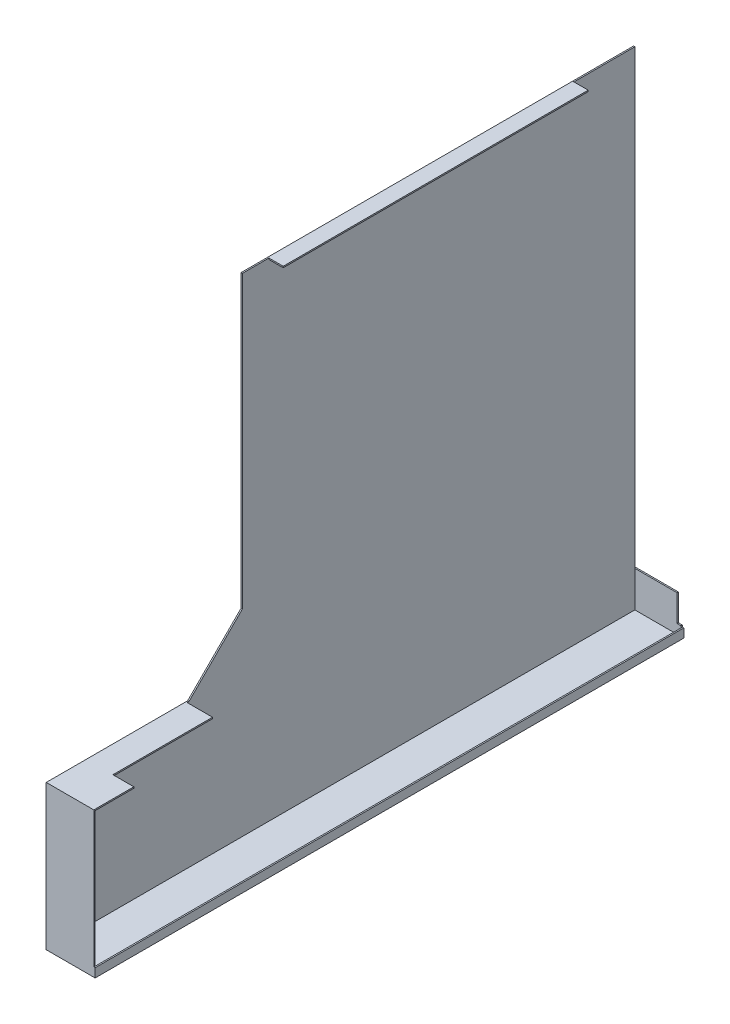
ISO-10303-21;
HEADER;
FILE_DESCRIPTION(('STEP AP214'),'2;1');
FILE_NAME('part.step','',(''),(''),'','','');
FILE_SCHEMA(('AUTOMOTIVE_DESIGN { 1 0 10303 214 1 1 1 1 }'));
ENDSEC;
DATA;
#1=APPLICATION_CONTEXT('core data for automotive mechanical design processes');
#2=APPLICATION_PROTOCOL_DEFINITION('international standard','automotive_design',2000,#1);
#3=PRODUCT_CONTEXT('',#1,'mechanical');
#4=PRODUCT('Part','Part','',(#3));
#5=PRODUCT_RELATED_PRODUCT_CATEGORY('part','',(#4));
#6=PRODUCT_DEFINITION_FORMATION('','',#4);
#7=PRODUCT_DEFINITION_CONTEXT('part definition',#1,'design');
#8=PRODUCT_DEFINITION('design','',#6,#7);
#9=PRODUCT_DEFINITION_SHAPE('','',#8);
#10=(LENGTH_UNIT() NAMED_UNIT(*) SI_UNIT(.MILLI.,.METRE.));
#11=(NAMED_UNIT(*) PLANE_ANGLE_UNIT() SI_UNIT($,.RADIAN.));
#12=(NAMED_UNIT(*) SI_UNIT($,.STERADIAN.) SOLID_ANGLE_UNIT());
#13=UNCERTAINTY_MEASURE_WITH_UNIT(LENGTH_MEASURE(1.E-05),#10,'distance_accuracy_value','');
#14=(GEOMETRIC_REPRESENTATION_CONTEXT(3) GLOBAL_UNCERTAINTY_ASSIGNED_CONTEXT((#13)) GLOBAL_UNIT_ASSIGNED_CONTEXT((#10,
#11,#12)) REPRESENTATION_CONTEXT('',''));
#15=CARTESIAN_POINT('',(0.,0.,0.));
#16=DIRECTION('',(0.,0.,1.));
#17=DIRECTION('',(1.,0.,0.));
#18=AXIS2_PLACEMENT_3D('',#15,#16,#17);
#19=CARTESIAN_POINT('',(-245.5,-307.,1434.5));
#20=DIRECTION('',(-1.,0.,0.));
#21=DIRECTION('',(0.,-1.,0.));
#22=AXIS2_PLACEMENT_3D('',#19,#20,#21);
#23=PLANE('',#22);
#24=DIRECTION('',(0.,-1.,0.));
#25=VECTOR('',#24,1.);
#26=CARTESIAN_POINT('',(-245.5,243.,1504.4));
#27=LINE('',#26,#25);
#28=CARTESIAN_POINT('',(-245.5,243.,1504.4));
#29=VERTEX_POINT('',#28);
#30=CARTESIAN_POINT('',(-245.5,239.,1504.4));
#31=VERTEX_POINT('',#30);
#32=EDGE_CURVE('E35',#29,#31,#27,.T.);
#33=ORIENTED_EDGE('',*,*,#32,.F.);
#34=DIRECTION('',(0.,0.,-1.));
#35=VECTOR('',#34,1.);
#36=CARTESIAN_POINT('',(-245.5,243.,1504.4));
#37=LINE('',#36,#35);
#38=CARTESIAN_POINT('',(-245.5,243.,1436.));
#39=VERTEX_POINT('',#38);
#40=EDGE_CURVE('E11',#29,#39,#37,.T.);
#41=ORIENTED_EDGE('',*,*,#40,.T.);
#42=DIRECTION('',(0.,-1.,0.));
#43=VECTOR('',#42,1.);
#44=CARTESIAN_POINT('',(-245.5,243.,1436.));
#45=LINE('',#44,#43);
#46=CARTESIAN_POINT('',(-245.5,-265.,1436.));
#47=VERTEX_POINT('',#46);
#48=EDGE_CURVE('E27',#39,#47,#45,.T.);
#49=ORIENTED_EDGE('',*,*,#48,.T.);
#50=DIRECTION('',(0.,0.,1.));
#51=VECTOR('',#50,1.);
#52=CARTESIAN_POINT('',(-245.5,-265.,1434.5));
#53=LINE('',#52,#51);
#54=CARTESIAN_POINT('',(-245.5,-265.,1434.5));
#55=VERTEX_POINT('',#54);
#56=EDGE_CURVE('E259',#55,#47,#53,.T.);
#57=ORIENTED_EDGE('',*,*,#56,.F.);
#58=DIRECTION('',(0.,-1.,0.));
#59=VECTOR('',#58,1.);
#60=CARTESIAN_POINT('',(-245.5,-265.,1434.5));
#61=LINE('',#60,#59);
#62=CARTESIAN_POINT('',(-245.5,-307.,1434.5));
#63=VERTEX_POINT('',#62);
#64=EDGE_CURVE('E319',#55,#63,#61,.T.);
#65=ORIENTED_EDGE('',*,*,#64,.T.);
#66=DIRECTION('',(0.,0.,1.));
#67=VECTOR('',#66,1.);
#68=CARTESIAN_POINT('',(-245.5,-307.,1434.5));
#69=LINE('',#68,#67);
#70=CARTESIAN_POINT('',(-245.5,-307.,2096.5));
#71=VERTEX_POINT('',#70);
#72=EDGE_CURVE('E316',#63,#71,#69,.T.);
#73=ORIENTED_EDGE('',*,*,#72,.T.);
#74=DIRECTION('',(0.,1.,0.));
#75=VECTOR('',#74,1.);
#76=CARTESIAN_POINT('',(-245.5,-307.,2096.5));
#77=LINE('',#76,#75);
#78=CARTESIAN_POINT('',(-245.5,-144.,2096.5));
#79=VERTEX_POINT('',#78);
#80=EDGE_CURVE('E320',#71,#79,#77,.T.);
#81=ORIENTED_EDGE('',*,*,#80,.T.);
#82=DIRECTION('',(0.,0.,-1.));
#83=VECTOR('',#82,1.);
#84=CARTESIAN_POINT('',(-245.5,-144.,2096.5));
#85=LINE('',#84,#83);
#86=CARTESIAN_POINT('',(-245.5,-144.,1937.5));
#87=VERTEX_POINT('',#86);
#88=EDGE_CURVE('E358',#79,#87,#85,.T.);
#89=ORIENTED_EDGE('',*,*,#88,.T.);
#90=DIRECTION('',(0.,-0.707106781186548,0.707106781186548));
#91=VECTOR('',#90,1.);
#92=CARTESIAN_POINT('',(-245.5,-84.,1877.5));
#93=LINE('',#92,#91);
#94=CARTESIAN_POINT('',(-245.5,-84.,1877.5));
#95=VERTEX_POINT('',#94);
#96=EDGE_CURVE('E369',#95,#87,#93,.T.);
#97=ORIENTED_EDGE('',*,*,#96,.F.);
#98=DIRECTION('',(0.,-1.,0.));
#99=VECTOR('',#98,1.);
#100=CARTESIAN_POINT('',(-245.5,243.,1877.5));
#101=LINE('',#100,#99);
#102=CARTESIAN_POINT('',(-245.5,243.,1877.5));
#103=VERTEX_POINT('',#102);
#104=EDGE_CURVE('E307',#103,#95,#101,.T.);
#105=ORIENTED_EDGE('',*,*,#104,.F.);
#106=DIRECTION('',(0.,0.,-1.));
#107=VECTOR('',#106,1.);
#108=CARTESIAN_POINT('',(-245.5,243.,1877.5));
#109=LINE('',#108,#107);
#110=CARTESIAN_POINT('',(-245.5,243.,1504.5));
#111=VERTEX_POINT('',#110);
#112=EDGE_CURVE('E330',#103,#111,#109,.T.);
#113=ORIENTED_EDGE('',*,*,#112,.T.);
#114=DIRECTION('',(0.,-1.,0.));
#115=VECTOR('',#114,1.);
#116=CARTESIAN_POINT('',(-245.5,243.,1504.5));
#117=LINE('',#116,#115);
#118=CARTESIAN_POINT('',(-245.5,239.,1504.5));
#119=VERTEX_POINT('',#118);
#120=EDGE_CURVE('E328',#111,#119,#117,.T.);
#121=ORIENTED_EDGE('',*,*,#120,.T.);
#122=DIRECTION('',(0.,0.,1.));
#123=VECTOR('',#122,1.);
#124=CARTESIAN_POINT('',(-245.5,239.,1504.4));
#125=LINE('',#124,#123);
#126=EDGE_CURVE('E255',#31,#119,#125,.T.);
#127=ORIENTED_EDGE('',*,*,#126,.F.);
#128=EDGE_LOOP('',(#33,#41,#49,#57,#65,#73,#81,#89,#97,#105,#113,#121,#127));
#129=FACE_BOUND('',#128,.T.);
#130=ADVANCED_FACE('F17',(#129),#23,.T.);
#131=CARTESIAN_POINT('',(-245.5,239.,1434.5));
#132=DIRECTION('',(0.,1.,0.));
#133=DIRECTION('',(0.,0.,-1.));
#134=AXIS2_PLACEMENT_3D('',#131,#132,#133);
#135=PLANE('',#134);
#136=DIRECTION('',(-1.,0.,0.));
#137=VECTOR('',#136,1.);
#138=CARTESIAN_POINT('',(-244.,239.,1504.4));
#139=LINE('',#138,#137);
#140=CARTESIAN_POINT('',(-244.,239.,1504.4));
#141=VERTEX_POINT('',#140);
#142=EDGE_CURVE('E331',#141,#31,#139,.T.);
#143=ORIENTED_EDGE('',*,*,#142,.T.);
#144=ORIENTED_EDGE('',*,*,#126,.T.);
#145=DIRECTION('',(1.,0.,0.));
#146=VECTOR('',#145,1.);
#147=CARTESIAN_POINT('',(-245.5,239.,1504.5));
#148=LINE('',#147,#146);
#149=CARTESIAN_POINT('',(-244.,239.,1504.5));
#150=VERTEX_POINT('',#149);
#151=EDGE_CURVE('E252',#119,#150,#148,.T.);
#152=ORIENTED_EDGE('',*,*,#151,.T.);
#153=DIRECTION('',(0.,0.,1.));
#154=VECTOR('',#153,1.);
#155=CARTESIAN_POINT('',(-244.,239.,1504.4));
#156=LINE('',#155,#154);
#157=EDGE_CURVE('E306',#141,#150,#156,.T.);
#158=ORIENTED_EDGE('',*,*,#157,.F.);
#159=EDGE_LOOP('',(#143,#144,#152,#158));
#160=FACE_BOUND('',#159,.T.);
#161=ADVANCED_FACE('F514',(#160),#135,.T.);
#162=CARTESIAN_POINT('',(-244.,243.,1434.5));
#163=DIRECTION('',(-1.,0.,0.));
#164=DIRECTION('',(0.,-1.,0.));
#165=AXIS2_PLACEMENT_3D('',#162,#163,#164);
#166=PLANE('',#165);
#167=DIRECTION('',(0.,-0.707106781186548,0.707106781186548));
#168=VECTOR('',#167,1.);
#169=CARTESIAN_POINT('',(-244.,-84.,1877.5));
#170=LINE('',#169,#168);
#171=CARTESIAN_POINT('',(-244.,-84.,1877.5));
#172=VERTEX_POINT('',#171);
#173=CARTESIAN_POINT('',(-244.,-144.,1937.5));
#174=VERTEX_POINT('',#173);
#175=EDGE_CURVE('E224',#172,#174,#170,.T.);
#176=ORIENTED_EDGE('',*,*,#175,.T.);
#177=DIRECTION('',(0.,0.,1.));
#178=VECTOR('',#177,1.);
#179=CARTESIAN_POINT('',(-244.,-144.,1937.5));
#180=LINE('',#179,#178);
#181=CARTESIAN_POINT('',(-244.,-144.,1939.5));
#182=VERTEX_POINT('',#181);
#183=EDGE_CURVE('E221',#174,#182,#180,.T.);
#184=ORIENTED_EDGE('',*,*,#183,.T.);
#185=DIRECTION('',(0.,1.,0.));
#186=VECTOR('',#185,1.);
#187=CARTESIAN_POINT('',(-244.,-145.5,1939.5));
#188=LINE('',#187,#186);
#189=CARTESIAN_POINT('',(-244.,-145.5,1939.5));
#190=VERTEX_POINT('',#189);
#191=EDGE_CURVE('E21',#190,#182,#188,.T.);
#192=ORIENTED_EDGE('',*,*,#191,.F.);
#193=DIRECTION('',(0.,0.,-1.));
#194=VECTOR('',#193,1.);
#195=CARTESIAN_POINT('',(-244.,-145.5,2095.));
#196=LINE('',#195,#194);
#197=CARTESIAN_POINT('',(-244.,-145.5,2095.));
#198=VERTEX_POINT('',#197);
#199=EDGE_CURVE('E219',#198,#190,#196,.T.);
#200=ORIENTED_EDGE('',*,*,#199,.F.);
#201=DIRECTION('',(0.,1.,0.));
#202=VECTOR('',#201,1.);
#203=CARTESIAN_POINT('',(-244.,-305.5,2095.));
#204=LINE('',#203,#202);
#205=CARTESIAN_POINT('',(-244.,-305.5,2095.));
#206=VERTEX_POINT('',#205);
#207=EDGE_CURVE('E404',#206,#198,#204,.T.);
#208=ORIENTED_EDGE('',*,*,#207,.F.);
#209=DIRECTION('',(0.,0.,1.));
#210=VECTOR('',#209,1.);
#211=CARTESIAN_POINT('',(-244.,-305.5,1436.));
#212=LINE('',#211,#210);
#213=CARTESIAN_POINT('',(-244.,-305.5,1436.));
#214=VERTEX_POINT('',#213);
#215=EDGE_CURVE('E338',#214,#206,#212,.T.);
#216=ORIENTED_EDGE('',*,*,#215,.F.);
#217=DIRECTION('',(0.,1.,0.));
#218=VECTOR('',#217,1.);
#219=CARTESIAN_POINT('',(-244.,-305.5,1436.));
#220=LINE('',#219,#218);
#221=CARTESIAN_POINT('',(-244.,-265.,1436.));
#222=VERTEX_POINT('',#221);
#223=EDGE_CURVE('E228',#214,#222,#220,.T.);
#224=ORIENTED_EDGE('',*,*,#223,.T.);
#225=DIRECTION('',(0.,-1.,0.));
#226=VECTOR('',#225,1.);
#227=CARTESIAN_POINT('',(-244.,243.,1436.));
#228=LINE('',#227,#226);
#229=CARTESIAN_POINT('',(-244.,243.,1436.));
#230=VERTEX_POINT('',#229);
#231=EDGE_CURVE('E260',#230,#222,#228,.T.);
#232=ORIENTED_EDGE('',*,*,#231,.F.);
#233=DIRECTION('',(0.,0.,1.));
#234=VECTOR('',#233,1.);
#235=CARTESIAN_POINT('',(-244.,243.,1436.));
#236=LINE('',#235,#234);
#237=CARTESIAN_POINT('',(-244.,243.,1504.4));
#238=VERTEX_POINT('',#237);
#239=EDGE_CURVE('E272',#230,#238,#236,.T.);
#240=ORIENTED_EDGE('',*,*,#239,.T.);
#241=DIRECTION('',(0.,-1.,0.));
#242=VECTOR('',#241,1.);
#243=CARTESIAN_POINT('',(-244.,243.,1504.4));
#244=LINE('',#243,#242);
#245=EDGE_CURVE('E275',#238,#141,#244,.T.);
#246=ORIENTED_EDGE('',*,*,#245,.T.);
#247=ORIENTED_EDGE('',*,*,#157,.T.);
#248=DIRECTION('',(0.,-1.,0.));
#249=VECTOR('',#248,1.);
#250=CARTESIAN_POINT('',(-244.,241.5,1504.5));
#251=LINE('',#250,#249);
#252=CARTESIAN_POINT('',(-244.,241.5,1504.5));
#253=VERTEX_POINT('',#252);
#254=EDGE_CURVE('E321',#253,#150,#251,.T.);
#255=ORIENTED_EDGE('',*,*,#254,.F.);
#256=DIRECTION('',(0.,0.,1.));
#257=VECTOR('',#256,1.);
#258=CARTESIAN_POINT('',(-244.,241.5,1504.5));
#259=LINE('',#258,#257);
#260=CARTESIAN_POINT('',(-244.,241.5,1847.5));
#261=VERTEX_POINT('',#260);
#262=EDGE_CURVE('E327',#253,#261,#259,.T.);
#263=ORIENTED_EDGE('',*,*,#262,.T.);
#264=DIRECTION('',(0.,1.,0.));
#265=VECTOR('',#264,1.);
#266=CARTESIAN_POINT('',(-244.,241.5,1847.5));
#267=LINE('',#266,#265);
#268=CARTESIAN_POINT('',(-244.,243.,1847.5));
#269=VERTEX_POINT('',#268);
#270=EDGE_CURVE('E310',#261,#269,#267,.T.);
#271=ORIENTED_EDGE('',*,*,#270,.T.);
#272=DIRECTION('',(0.,0.,-1.));
#273=VECTOR('',#272,1.);
#274=CARTESIAN_POINT('',(-244.,243.,1877.5));
#275=LINE('',#274,#273);
#276=CARTESIAN_POINT('',(-244.,243.,1877.5));
#277=VERTEX_POINT('',#276);
#278=EDGE_CURVE('E344',#277,#269,#275,.T.);
#279=ORIENTED_EDGE('',*,*,#278,.F.);
#280=DIRECTION('',(0.,1.,0.));
#281=VECTOR('',#280,1.);
#282=CARTESIAN_POINT('',(-244.,-84.,1877.5));
#283=LINE('',#282,#281);
#284=EDGE_CURVE('E349',#172,#277,#283,.T.);
#285=ORIENTED_EDGE('',*,*,#284,.F.);
#286=EDGE_LOOP('',(#176,#184,#192,#200,#208,#216,#224,#232,#240,#246,#247,#255,#263,#271,#279,#285));
#287=FACE_BOUND('',#286,.T.);
#288=ADVANCED_FACE('F222',(#287),#166,.F.);
#289=CARTESIAN_POINT('',(-245.5,243.,1877.5));
#290=DIRECTION('',(0.,0.,-1.));
#291=DIRECTION('',(0.,1.,0.));
#292=AXIS2_PLACEMENT_3D('',#289,#290,#291);
#293=PLANE('',#292);
#294=DIRECTION('',(1.,0.,0.));
#295=VECTOR('',#294,1.);
#296=CARTESIAN_POINT('',(-245.5,243.,1877.5));
#297=LINE('',#296,#295);
#298=EDGE_CURVE('E341',#103,#277,#297,.T.);
#299=ORIENTED_EDGE('',*,*,#298,.F.);
#300=ORIENTED_EDGE('',*,*,#104,.T.);
#301=DIRECTION('',(1.,0.,0.));
#302=VECTOR('',#301,1.);
#303=CARTESIAN_POINT('',(-245.5,-84.,1877.5));
#304=LINE('',#303,#302);
#305=EDGE_CURVE('E311',#95,#172,#304,.T.);
#306=ORIENTED_EDGE('',*,*,#305,.T.);
#307=ORIENTED_EDGE('',*,*,#284,.T.);
#308=EDGE_LOOP('',(#299,#300,#306,#307));
#309=FACE_BOUND('',#308,.T.);
#310=ADVANCED_FACE('F525',(#309),#293,.F.);
#311=CARTESIAN_POINT('',(-245.5,-84.,1877.5));
#312=DIRECTION('',(0.,-0.707106781186548,-0.707106781186548));
#313=DIRECTION('',(-1.,0.,0.));
#314=AXIS2_PLACEMENT_3D('',#311,#312,#313);
#315=PLANE('',#314);
#316=ORIENTED_EDGE('',*,*,#305,.F.);
#317=ORIENTED_EDGE('',*,*,#96,.T.);
#318=DIRECTION('',(1.,0.,0.));
#319=VECTOR('',#318,1.);
#320=CARTESIAN_POINT('',(-245.5,-144.,1937.5));
#321=LINE('',#320,#319);
#322=EDGE_CURVE('E391',#87,#174,#321,.T.);
#323=ORIENTED_EDGE('',*,*,#322,.T.);
#324=ORIENTED_EDGE('',*,*,#175,.F.);
#325=EDGE_LOOP('',(#316,#317,#323,#324));
#326=FACE_BOUND('',#325,.T.);
#327=ADVANCED_FACE('F529',(#326),#315,.F.);
#328=CARTESIAN_POINT('',(-245.5,-144.,1937.5));
#329=DIRECTION('',(0.,-1.,0.));
#330=DIRECTION('',(1.,0.,0.));
#331=AXIS2_PLACEMENT_3D('',#328,#329,#330);
#332=PLANE('',#331);
#333=ORIENTED_EDGE('',*,*,#322,.F.);
#334=ORIENTED_EDGE('',*,*,#88,.F.);
#335=DIRECTION('',(-1.,0.,0.));
#336=VECTOR('',#335,1.);
#337=CARTESIAN_POINT('',(-192.,-144.,2096.5));
#338=LINE('',#337,#336);
#339=CARTESIAN_POINT('',(-192.,-144.,2096.5));
#340=VERTEX_POINT('',#339);
#341=EDGE_CURVE('E245',#340,#79,#338,.T.);
#342=ORIENTED_EDGE('',*,*,#341,.F.);
#343=DIRECTION('',(0.,0.,-1.));
#344=VECTOR('',#343,1.);
#345=CARTESIAN_POINT('',(-192.,-144.,2096.5));
#346=LINE('',#345,#344);
#347=CARTESIAN_POINT('',(-192.,-144.,2051.5));
#348=VERTEX_POINT('',#347);
#349=EDGE_CURVE('E256',#340,#348,#346,.T.);
#350=ORIENTED_EDGE('',*,*,#349,.T.);
#351=DIRECTION('',(-1.,0.,0.));
#352=VECTOR('',#351,1.);
#353=CARTESIAN_POINT('',(-192.,-144.,2051.5));
#354=LINE('',#353,#352);
#355=CARTESIAN_POINT('',(-215.5,-144.,2051.5));
#356=VERTEX_POINT('',#355);
#357=EDGE_CURVE('E236',#348,#356,#354,.T.);
#358=ORIENTED_EDGE('',*,*,#357,.T.);
#359=DIRECTION('',(0.,0.,-1.));
#360=VECTOR('',#359,1.);
#361=CARTESIAN_POINT('',(-215.5,-144.,2051.5));
#362=LINE('',#361,#360);
#363=CARTESIAN_POINT('',(-215.5,-144.,1939.5));
#364=VERTEX_POINT('',#363);
#365=EDGE_CURVE('E232',#356,#364,#362,.T.);
#366=ORIENTED_EDGE('',*,*,#365,.T.);
#367=DIRECTION('',(-1.,0.,0.));
#368=VECTOR('',#367,1.);
#369=CARTESIAN_POINT('',(-215.5,-144.,1939.5));
#370=LINE('',#369,#368);
#371=EDGE_CURVE('E214',#364,#182,#370,.T.);
#372=ORIENTED_EDGE('',*,*,#371,.T.);
#373=ORIENTED_EDGE('',*,*,#183,.F.);
#374=EDGE_LOOP('',(#333,#334,#342,#350,#358,#366,#372,#373));
#375=FACE_BOUND('',#374,.T.);
#376=ADVANCED_FACE('F230',(#375),#332,.F.);
#377=CARTESIAN_POINT('',(-215.5,-144.,1939.5));
#378=DIRECTION('',(0.,0.,-1.));
#379=DIRECTION('',(0.,1.,0.));
#380=AXIS2_PLACEMENT_3D('',#377,#378,#379);
#381=PLANE('',#380);
#382=ORIENTED_EDGE('',*,*,#371,.F.);
#383=DIRECTION('',(0.,-1.,0.));
#384=VECTOR('',#383,1.);
#385=CARTESIAN_POINT('',(-215.5,-144.,1939.5));
#386=LINE('',#385,#384);
#387=CARTESIAN_POINT('',(-215.5,-145.5,1939.5));
#388=VERTEX_POINT('',#387);
#389=EDGE_CURVE('E234',#364,#388,#386,.T.);
#390=ORIENTED_EDGE('',*,*,#389,.T.);
#391=DIRECTION('',(-1.,0.,0.));
#392=VECTOR('',#391,1.);
#393=CARTESIAN_POINT('',(-215.5,-145.5,1939.5));
#394=LINE('',#393,#392);
#395=EDGE_CURVE('E216',#388,#190,#394,.T.);
#396=ORIENTED_EDGE('',*,*,#395,.T.);
#397=ORIENTED_EDGE('',*,*,#191,.T.);
#398=EDGE_LOOP('',(#382,#390,#396,#397));
#399=FACE_BOUND('',#398,.T.);
#400=ADVANCED_FACE('F211',(#399),#381,.T.);
#401=CARTESIAN_POINT('',(-245.5,-145.5,1434.5));
#402=DIRECTION('',(0.,1.,0.));
#403=DIRECTION('',(0.,0.,-1.));
#404=AXIS2_PLACEMENT_3D('',#401,#402,#403);
#405=PLANE('',#404);
#406=ORIENTED_EDGE('',*,*,#395,.F.);
#407=DIRECTION('',(0.,0.,-1.));
#408=VECTOR('',#407,1.);
#409=CARTESIAN_POINT('',(-215.5,-145.5,2051.5));
#410=LINE('',#409,#408);
#411=CARTESIAN_POINT('',(-215.5,-145.5,2051.5));
#412=VERTEX_POINT('',#411);
#413=EDGE_CURVE('E364',#412,#388,#410,.T.);
#414=ORIENTED_EDGE('',*,*,#413,.F.);
#415=DIRECTION('',(-1.,0.,0.));
#416=VECTOR('',#415,1.);
#417=CARTESIAN_POINT('',(-192.,-145.5,2051.5));
#418=LINE('',#417,#416);
#419=CARTESIAN_POINT('',(-192.,-145.5,2051.5));
#420=VERTEX_POINT('',#419);
#421=EDGE_CURVE('E363',#420,#412,#418,.T.);
#422=ORIENTED_EDGE('',*,*,#421,.F.);
#423=DIRECTION('',(0.,0.,-1.));
#424=VECTOR('',#423,1.);
#425=CARTESIAN_POINT('',(-192.,-145.5,2095.));
#426=LINE('',#425,#424);
#427=CARTESIAN_POINT('',(-192.,-145.5,2095.));
#428=VERTEX_POINT('',#427);
#429=EDGE_CURVE('E414',#428,#420,#426,.T.);
#430=ORIENTED_EDGE('',*,*,#429,.F.);
#431=DIRECTION('',(1.,0.,0.));
#432=VECTOR('',#431,1.);
#433=CARTESIAN_POINT('',(-244.,-145.5,2095.));
#434=LINE('',#433,#432);
#435=EDGE_CURVE('E380',#198,#428,#434,.T.);
#436=ORIENTED_EDGE('',*,*,#435,.F.);
#437=ORIENTED_EDGE('',*,*,#199,.T.);
#438=EDGE_LOOP('',(#406,#414,#422,#430,#436,#437));
#439=FACE_BOUND('',#438,.T.);
#440=ADVANCED_FACE('F463',(#439),#405,.F.);
#441=CARTESIAN_POINT('',(-245.5,-307.,2095.));
#442=DIRECTION('',(0.,0.,1.));
#443=DIRECTION('',(1.,0.,0.));
#444=AXIS2_PLACEMENT_3D('',#441,#442,#443);
#445=PLANE('',#444);
#446=DIRECTION('',(0.,1.,0.));
#447=VECTOR('',#446,1.);
#448=CARTESIAN_POINT('',(-192.,-297.,2095.));
#449=LINE('',#448,#447);
#450=CARTESIAN_POINT('',(-192.,-297.,2095.));
#451=VERTEX_POINT('',#450);
#452=EDGE_CURVE('E434',#451,#428,#449,.T.);
#453=ORIENTED_EDGE('',*,*,#452,.F.);
#454=DIRECTION('',(0.,-1.,0.));
#455=VECTOR('',#454,1.);
#456=CARTESIAN_POINT('',(-192.,-297.,2095.));
#457=LINE('',#456,#455);
#458=CARTESIAN_POINT('',(-192.,-305.5,2095.));
#459=VERTEX_POINT('',#458);
#460=EDGE_CURVE('E346',#451,#459,#457,.T.);
#461=ORIENTED_EDGE('',*,*,#460,.T.);
#462=DIRECTION('',(1.,0.,0.));
#463=VECTOR('',#462,1.);
#464=CARTESIAN_POINT('',(-244.,-305.5,2095.));
#465=LINE('',#464,#463);
#466=EDGE_CURVE('E378',#206,#459,#465,.T.);
#467=ORIENTED_EDGE('',*,*,#466,.F.);
#468=ORIENTED_EDGE('',*,*,#207,.T.);
#469=ORIENTED_EDGE('',*,*,#435,.T.);
#470=EDGE_LOOP('',(#453,#461,#467,#468,#469));
#471=FACE_BOUND('',#470,.T.);
#472=ADVANCED_FACE('F458',(#471),#445,.F.);
#473=CARTESIAN_POINT('',(-245.5,-305.5,1434.5));
#474=DIRECTION('',(0.,-1.,0.));
#475=DIRECTION('',(1.,0.,0.));
#476=AXIS2_PLACEMENT_3D('',#473,#474,#475);
#477=PLANE('',#476);
#478=ORIENTED_EDGE('',*,*,#466,.T.);
#479=DIRECTION('',(0.,0.,1.));
#480=VECTOR('',#479,1.);
#481=CARTESIAN_POINT('',(-192.,-305.5,1436.));
#482=LINE('',#481,#480);
#483=CARTESIAN_POINT('',(-192.,-305.5,1436.));
#484=VERTEX_POINT('',#483);
#485=EDGE_CURVE('E280',#484,#459,#482,.T.);
#486=ORIENTED_EDGE('',*,*,#485,.F.);
#487=DIRECTION('',(1.,0.,0.));
#488=VECTOR('',#487,1.);
#489=CARTESIAN_POINT('',(-244.,-305.5,1436.));
#490=LINE('',#489,#488);
#491=EDGE_CURVE('E247',#214,#484,#490,.T.);
#492=ORIENTED_EDGE('',*,*,#491,.F.);
#493=ORIENTED_EDGE('',*,*,#215,.T.);
#494=EDGE_LOOP('',(#478,#486,#492,#493));
#495=FACE_BOUND('',#494,.T.);
#496=ADVANCED_FACE('F500',(#495),#477,.F.);
#497=CARTESIAN_POINT('',(-245.5,-307.,1436.));
#498=DIRECTION('',(0.,0.,-1.));
#499=DIRECTION('',(0.,1.,0.));
#500=AXIS2_PLACEMENT_3D('',#497,#498,#499);
#501=PLANE('',#500);
#502=DIRECTION('',(0.,1.,0.));
#503=VECTOR('',#502,1.);
#504=CARTESIAN_POINT('',(-196.5,-295.,1436.));
#505=LINE('',#504,#503);
#506=CARTESIAN_POINT('',(-196.5,-295.,1436.));
#507=VERTEX_POINT('',#506);
#508=CARTESIAN_POINT('',(-196.5,-265.,1436.));
#509=VERTEX_POINT('',#508);
#510=EDGE_CURVE('E335',#507,#509,#505,.T.);
#511=ORIENTED_EDGE('',*,*,#510,.T.);
#512=DIRECTION('',(-1.,0.,0.));
#513=VECTOR('',#512,1.);
#514=CARTESIAN_POINT('',(-196.5,-265.,1436.));
#515=LINE('',#514,#513);
#516=EDGE_CURVE('E250',#509,#222,#515,.T.);
#517=ORIENTED_EDGE('',*,*,#516,.T.);
#518=ORIENTED_EDGE('',*,*,#223,.F.);
#519=ORIENTED_EDGE('',*,*,#491,.T.);
#520=DIRECTION('',(0.,1.,0.));
#521=VECTOR('',#520,1.);
#522=CARTESIAN_POINT('',(-192.,-305.5,1436.));
#523=LINE('',#522,#521);
#524=CARTESIAN_POINT('',(-192.,-297.,1436.));
#525=VERTEX_POINT('',#524);
#526=EDGE_CURVE('E251',#484,#525,#523,.T.);
#527=ORIENTED_EDGE('',*,*,#526,.T.);
#528=DIRECTION('',(0.,1.,0.));
#529=VECTOR('',#528,1.);
#530=CARTESIAN_POINT('',(-192.,-297.,1436.));
#531=LINE('',#530,#529);
#532=CARTESIAN_POINT('',(-192.,-295.,1436.));
#533=VERTEX_POINT('',#532);
#534=EDGE_CURVE('E366',#525,#533,#531,.T.);
#535=ORIENTED_EDGE('',*,*,#534,.T.);
#536=DIRECTION('',(-1.,0.,0.));
#537=VECTOR('',#536,1.);
#538=CARTESIAN_POINT('',(-192.,-295.,1436.));
#539=LINE('',#538,#537);
#540=EDGE_CURVE('E293',#533,#507,#539,.T.);
#541=ORIENTED_EDGE('',*,*,#540,.T.);
#542=EDGE_LOOP('',(#511,#517,#518,#519,#527,#535,#541));
#543=FACE_BOUND('',#542,.T.);
#544=ADVANCED_FACE('F494',(#543),#501,.F.);
#545=CARTESIAN_POINT('',(-175.5,-295.,1434.5));
#546=DIRECTION('',(0.,-1.,0.));
#547=DIRECTION('',(1.,0.,0.));
#548=AXIS2_PLACEMENT_3D('',#545,#546,#547);
#549=PLANE('',#548);
#550=DIRECTION('',(0.,0.,-1.));
#551=VECTOR('',#550,1.);
#552=CARTESIAN_POINT('',(-192.,-295.,1436.));
#553=LINE('',#552,#551);
#554=CARTESIAN_POINT('',(-192.,-295.,1434.5));
#555=VERTEX_POINT('',#554);
#556=EDGE_CURVE('E290',#533,#555,#553,.T.);
#557=ORIENTED_EDGE('',*,*,#556,.T.);
#558=DIRECTION('',(-1.,0.,0.));
#559=VECTOR('',#558,1.);
#560=CARTESIAN_POINT('',(-192.,-295.,1434.5));
#561=LINE('',#560,#559);
#562=CARTESIAN_POINT('',(-196.5,-295.,1434.5));
#563=VERTEX_POINT('',#562);
#564=EDGE_CURVE('E284',#555,#563,#561,.T.);
#565=ORIENTED_EDGE('',*,*,#564,.T.);
#566=DIRECTION('',(0.,0.,1.));
#567=VECTOR('',#566,1.);
#568=CARTESIAN_POINT('',(-196.5,-295.,1434.5));
#569=LINE('',#568,#567);
#570=EDGE_CURVE('E281',#563,#507,#569,.T.);
#571=ORIENTED_EDGE('',*,*,#570,.T.);
#572=ORIENTED_EDGE('',*,*,#540,.F.);
#573=EDGE_LOOP('',(#557,#565,#571,#572));
#574=FACE_BOUND('',#573,.T.);
#575=ADVANCED_FACE('F537',(#574),#549,.F.);
#576=CARTESIAN_POINT('',(-196.5,-295.,1434.5));
#577=DIRECTION('',(-1.,0.,0.));
#578=DIRECTION('',(0.,-1.,0.));
#579=AXIS2_PLACEMENT_3D('',#576,#577,#578);
#580=PLANE('',#579);
#581=ORIENTED_EDGE('',*,*,#570,.F.);
#582=DIRECTION('',(0.,1.,0.));
#583=VECTOR('',#582,1.);
#584=CARTESIAN_POINT('',(-196.5,-295.,1434.5));
#585=LINE('',#584,#583);
#586=CARTESIAN_POINT('',(-196.5,-265.,1434.5));
#587=VERTEX_POINT('',#586);
#588=EDGE_CURVE('E285',#563,#587,#585,.T.);
#589=ORIENTED_EDGE('',*,*,#588,.T.);
#590=DIRECTION('',(0.,0.,1.));
#591=VECTOR('',#590,1.);
#592=CARTESIAN_POINT('',(-196.5,-265.,1434.5));
#593=LINE('',#592,#591);
#594=EDGE_CURVE('E263',#587,#509,#593,.T.);
#595=ORIENTED_EDGE('',*,*,#594,.T.);
#596=ORIENTED_EDGE('',*,*,#510,.F.);
#597=EDGE_LOOP('',(#581,#589,#595,#596));
#598=FACE_BOUND('',#597,.T.);
#599=ADVANCED_FACE('F535',(#598),#580,.F.);
#600=CARTESIAN_POINT('',(-196.5,-265.,1434.5));
#601=DIRECTION('',(0.,-1.,0.));
#602=DIRECTION('',(1.,0.,0.));
#603=AXIS2_PLACEMENT_3D('',#600,#601,#602);
#604=PLANE('',#603);
#605=ORIENTED_EDGE('',*,*,#594,.F.);
#606=DIRECTION('',(1.,0.,0.));
#607=VECTOR('',#606,1.);
#608=CARTESIAN_POINT('',(-245.5,-265.,1434.5));
#609=LINE('',#608,#607);
#610=EDGE_CURVE('E303',#55,#587,#609,.T.);
#611=ORIENTED_EDGE('',*,*,#610,.F.);
#612=ORIENTED_EDGE('',*,*,#56,.T.);
#613=DIRECTION('',(-1.,0.,0.));
#614=VECTOR('',#613,1.);
#615=CARTESIAN_POINT('',(-244.,-265.,1436.));
#616=LINE('',#615,#614);
#617=EDGE_CURVE('E257',#222,#47,#616,.T.);
#618=ORIENTED_EDGE('',*,*,#617,.F.);
#619=ORIENTED_EDGE('',*,*,#516,.F.);
#620=EDGE_LOOP('',(#605,#611,#612,#618,#619));
#621=FACE_BOUND('',#620,.T.);
#622=ADVANCED_FACE('F503',(#621),#604,.F.);
#623=CARTESIAN_POINT('',(-245.5,-307.,1436.));
#624=DIRECTION('',(0.,0.,-1.));
#625=DIRECTION('',(0.,1.,0.));
#626=AXIS2_PLACEMENT_3D('',#623,#624,#625);
#627=PLANE('',#626);
#628=ORIENTED_EDGE('',*,*,#617,.T.);
#629=ORIENTED_EDGE('',*,*,#48,.F.);
#630=DIRECTION('',(-1.,0.,0.));
#631=VECTOR('',#630,1.);
#632=CARTESIAN_POINT('',(-244.,243.,1436.));
#633=LINE('',#632,#631);
#634=EDGE_CURVE('E265',#230,#39,#633,.T.);
#635=ORIENTED_EDGE('',*,*,#634,.F.);
#636=ORIENTED_EDGE('',*,*,#231,.T.);
#637=EDGE_LOOP('',(#628,#629,#635,#636));
#638=FACE_BOUND('',#637,.T.);
#639=ADVANCED_FACE('F505',(#638),#627,.T.);
#640=CARTESIAN_POINT('',(-245.5,243.,2096.5));
#641=DIRECTION('',(0.,1.,0.));
#642=DIRECTION('',(0.,0.,-1.));
#643=AXIS2_PLACEMENT_3D('',#640,#641,#642);
#644=PLANE('',#643);
#645=ORIENTED_EDGE('',*,*,#239,.F.);
#646=ORIENTED_EDGE('',*,*,#634,.T.);
#647=ORIENTED_EDGE('',*,*,#40,.F.);
#648=DIRECTION('',(1.,0.,0.));
#649=VECTOR('',#648,1.);
#650=CARTESIAN_POINT('',(-245.5,243.,1504.4));
#651=LINE('',#650,#649);
#652=EDGE_CURVE('E269',#29,#238,#651,.T.);
#653=ORIENTED_EDGE('',*,*,#652,.T.);
#654=EDGE_LOOP('',(#645,#646,#647,#653));
#655=FACE_BOUND('',#654,.T.);
#656=ADVANCED_FACE('F508',(#655),#644,.T.);
#657=CARTESIAN_POINT('',(-245.5,243.,2096.5));
#658=DIRECTION('',(0.,1.,0.));
#659=DIRECTION('',(0.,0.,-1.));
#660=AXIS2_PLACEMENT_3D('',#657,#658,#659);
#661=PLANE('',#660);
#662=DIRECTION('',(-1.,0.,0.));
#663=VECTOR('',#662,1.);
#664=CARTESIAN_POINT('',(-228.,243.,1847.5));
#665=LINE('',#664,#663);
#666=CARTESIAN_POINT('',(-228.,243.,1847.5));
#667=VERTEX_POINT('',#666);
#668=EDGE_CURVE('E302',#667,#269,#665,.T.);
#669=ORIENTED_EDGE('',*,*,#668,.F.);
#670=DIRECTION('',(0.,0.,-1.));
#671=VECTOR('',#670,1.);
#672=CARTESIAN_POINT('',(-228.,243.,1847.5));
#673=LINE('',#672,#671);
#674=CARTESIAN_POINT('',(-228.,243.,1504.5));
#675=VERTEX_POINT('',#674);
#676=EDGE_CURVE('E314',#667,#675,#673,.T.);
#677=ORIENTED_EDGE('',*,*,#676,.T.);
#678=DIRECTION('',(-1.,0.,0.));
#679=VECTOR('',#678,1.);
#680=CARTESIAN_POINT('',(-228.,243.,1504.5));
#681=LINE('',#680,#679);
#682=EDGE_CURVE('E148',#675,#111,#681,.T.);
#683=ORIENTED_EDGE('',*,*,#682,.T.);
#684=ORIENTED_EDGE('',*,*,#112,.F.);
#685=ORIENTED_EDGE('',*,*,#298,.T.);
#686=ORIENTED_EDGE('',*,*,#278,.T.);
#687=EDGE_LOOP('',(#669,#677,#683,#684,#685,#686));
#688=FACE_BOUND('',#687,.T.);
#689=ADVANCED_FACE('F19',(#688),#661,.T.);
#690=CARTESIAN_POINT('',(-244.,243.,1504.4));
#691=DIRECTION('',(0.,0.,-1.));
#692=DIRECTION('',(0.,1.,0.));
#693=AXIS2_PLACEMENT_3D('',#690,#691,#692);
#694=PLANE('',#693);
#695=ORIENTED_EDGE('',*,*,#142,.F.);
#696=ORIENTED_EDGE('',*,*,#245,.F.);
#697=ORIENTED_EDGE('',*,*,#652,.F.);
#698=ORIENTED_EDGE('',*,*,#32,.T.);
#699=EDGE_LOOP('',(#695,#696,#697,#698));
#700=FACE_BOUND('',#699,.T.);
#701=ADVANCED_FACE('F512',(#700),#694,.F.);
#702=CARTESIAN_POINT('',(-244.,243.,1504.5));
#703=DIRECTION('',(0.,0.,1.));
#704=DIRECTION('',(1.,0.,0.));
#705=AXIS2_PLACEMENT_3D('',#702,#703,#704);
#706=PLANE('',#705);
#707=DIRECTION('',(0.,-1.,0.));
#708=VECTOR('',#707,1.);
#709=CARTESIAN_POINT('',(-228.,243.,1504.5));
#710=LINE('',#709,#708);
#711=CARTESIAN_POINT('',(-228.,241.5,1504.5));
#712=VERTEX_POINT('',#711);
#713=EDGE_CURVE('E324',#675,#712,#710,.T.);
#714=ORIENTED_EDGE('',*,*,#713,.T.);
#715=DIRECTION('',(1.,0.,0.));
#716=VECTOR('',#715,1.);
#717=CARTESIAN_POINT('',(-244.,241.5,1504.5));
#718=LINE('',#717,#716);
#719=EDGE_CURVE('E141',#253,#712,#718,.T.);
#720=ORIENTED_EDGE('',*,*,#719,.F.);
#721=ORIENTED_EDGE('',*,*,#254,.T.);
#722=ORIENTED_EDGE('',*,*,#151,.F.);
#723=ORIENTED_EDGE('',*,*,#120,.F.);
#724=ORIENTED_EDGE('',*,*,#682,.F.);
#725=EDGE_LOOP('',(#714,#720,#721,#722,#723,#724));
#726=FACE_BOUND('',#725,.T.);
#727=ADVANCED_FACE('F516',(#726),#706,.F.);
#728=CARTESIAN_POINT('',(-245.5,241.5,1434.5));
#729=DIRECTION('',(0.,1.,0.));
#730=DIRECTION('',(0.,0.,-1.));
#731=AXIS2_PLACEMENT_3D('',#728,#729,#730);
#732=PLANE('',#731);
#733=ORIENTED_EDGE('',*,*,#262,.F.);
#734=ORIENTED_EDGE('',*,*,#719,.T.);
#735=DIRECTION('',(0.,0.,1.));
#736=VECTOR('',#735,1.);
#737=CARTESIAN_POINT('',(-228.,241.5,1504.5));
#738=LINE('',#737,#736);
#739=CARTESIAN_POINT('',(-228.,241.5,1847.5));
#740=VERTEX_POINT('',#739);
#741=EDGE_CURVE('E375',#712,#740,#738,.T.);
#742=ORIENTED_EDGE('',*,*,#741,.T.);
#743=DIRECTION('',(-1.,0.,0.));
#744=VECTOR('',#743,1.);
#745=CARTESIAN_POINT('',(-228.,241.5,1847.5));
#746=LINE('',#745,#744);
#747=EDGE_CURVE('E399',#740,#261,#746,.T.);
#748=ORIENTED_EDGE('',*,*,#747,.T.);
#749=EDGE_LOOP('',(#733,#734,#742,#748));
#750=FACE_BOUND('',#749,.T.);
#751=ADVANCED_FACE('F517',(#750),#732,.F.);
#752=CARTESIAN_POINT('',(-228.,241.5,1847.5));
#753=DIRECTION('',(0.,0.,-1.));
#754=DIRECTION('',(0.,1.,0.));
#755=AXIS2_PLACEMENT_3D('',#752,#753,#754);
#756=PLANE('',#755);
#757=ORIENTED_EDGE('',*,*,#270,.F.);
#758=ORIENTED_EDGE('',*,*,#747,.F.);
#759=DIRECTION('',(0.,1.,0.));
#760=VECTOR('',#759,1.);
#761=CARTESIAN_POINT('',(-228.,241.5,1847.5));
#762=LINE('',#761,#760);
#763=EDGE_CURVE('E422',#740,#667,#762,.T.);
#764=ORIENTED_EDGE('',*,*,#763,.T.);
#765=ORIENTED_EDGE('',*,*,#668,.T.);
#766=EDGE_LOOP('',(#757,#758,#764,#765));
#767=FACE_BOUND('',#766,.T.);
#768=ADVANCED_FACE('F521',(#767),#756,.F.);
#769=CARTESIAN_POINT('',(-228.,243.,1504.5));
#770=DIRECTION('',(-1.,0.,0.));
#771=DIRECTION('',(0.,-1.,0.));
#772=AXIS2_PLACEMENT_3D('',#769,#770,#771);
#773=PLANE('',#772);
#774=ORIENTED_EDGE('',*,*,#741,.F.);
#775=ORIENTED_EDGE('',*,*,#713,.F.);
#776=ORIENTED_EDGE('',*,*,#676,.F.);
#777=ORIENTED_EDGE('',*,*,#763,.F.);
#778=EDGE_LOOP('',(#774,#775,#776,#777));
#779=FACE_BOUND('',#778,.T.);
#780=ADVANCED_FACE('F560',(#779),#773,.F.);
#781=CARTESIAN_POINT('',(-245.5,243.,1434.5));
#782=DIRECTION('',(0.,0.,-1.));
#783=DIRECTION('',(0.,1.,0.));
#784=AXIS2_PLACEMENT_3D('',#781,#782,#783);
#785=PLANE('',#784);
#786=DIRECTION('',(-1.,0.,0.));
#787=VECTOR('',#786,1.);
#788=CARTESIAN_POINT('',(-190.5,-297.,1434.5));
#789=LINE('',#788,#787);
#790=CARTESIAN_POINT('',(-190.5,-297.,1434.5));
#791=VERTEX_POINT('',#790);
#792=CARTESIAN_POINT('',(-192.,-297.,1434.5));
#793=VERTEX_POINT('',#792);
#794=EDGE_CURVE('E279',#791,#793,#789,.T.);
#795=ORIENTED_EDGE('',*,*,#794,.F.);
#796=DIRECTION('',(0.,-1.,0.));
#797=VECTOR('',#796,1.);
#798=CARTESIAN_POINT('',(-190.5,-297.,1434.5));
#799=LINE('',#798,#797);
#800=CARTESIAN_POINT('',(-190.5,-307.,1434.5));
#801=VERTEX_POINT('',#800);
#802=EDGE_CURVE('E299',#791,#801,#799,.T.);
#803=ORIENTED_EDGE('',*,*,#802,.T.);
#804=DIRECTION('',(1.,0.,0.));
#805=VECTOR('',#804,1.);
#806=CARTESIAN_POINT('',(-245.5,-307.,1434.5));
#807=LINE('',#806,#805);
#808=EDGE_CURVE('E289',#63,#801,#807,.T.);
#809=ORIENTED_EDGE('',*,*,#808,.F.);
#810=ORIENTED_EDGE('',*,*,#64,.F.);
#811=ORIENTED_EDGE('',*,*,#610,.T.);
#812=ORIENTED_EDGE('',*,*,#588,.F.);
#813=ORIENTED_EDGE('',*,*,#564,.F.);
#814=DIRECTION('',(0.,-1.,0.));
#815=VECTOR('',#814,1.);
#816=CARTESIAN_POINT('',(-192.,-295.,1434.5));
#817=LINE('',#816,#815);
#818=EDGE_CURVE('E297',#555,#793,#817,.T.);
#819=ORIENTED_EDGE('',*,*,#818,.T.);
#820=EDGE_LOOP('',(#795,#803,#809,#810,#811,#812,#813,#819));
#821=FACE_BOUND('',#820,.T.);
#822=ADVANCED_FACE('F484',(#821),#785,.T.);
#823=CARTESIAN_POINT('',(-192.,-144.,2096.5));
#824=DIRECTION('',(1.,0.,0.));
#825=DIRECTION('',(0.,0.,1.));
#826=AXIS2_PLACEMENT_3D('',#823,#824,#825);
#827=PLANE('',#826);
#828=DIRECTION('',(0.,0.,-1.));
#829=VECTOR('',#828,1.);
#830=CARTESIAN_POINT('',(-192.,-297.,1436.));
#831=LINE('',#830,#829);
#832=EDGE_CURVE('E294',#525,#793,#831,.T.);
#833=ORIENTED_EDGE('',*,*,#832,.T.);
#834=ORIENTED_EDGE('',*,*,#818,.F.);
#835=ORIENTED_EDGE('',*,*,#556,.F.);
#836=ORIENTED_EDGE('',*,*,#534,.F.);
#837=EDGE_LOOP('',(#833,#834,#835,#836));
#838=FACE_BOUND('',#837,.T.);
#839=ADVANCED_FACE('F491',(#838),#827,.T.);
#840=CARTESIAN_POINT('',(-192.,-144.,2096.5));
#841=DIRECTION('',(1.,0.,0.));
#842=DIRECTION('',(0.,0.,1.));
#843=AXIS2_PLACEMENT_3D('',#840,#841,#842);
#844=PLANE('',#843);
#845=DIRECTION('',(0.,-1.,0.));
#846=VECTOR('',#845,1.);
#847=CARTESIAN_POINT('',(-192.,-144.,2051.5));
#848=LINE('',#847,#846);
#849=EDGE_CURVE('E419',#348,#420,#848,.T.);
#850=ORIENTED_EDGE('',*,*,#849,.F.);
#851=ORIENTED_EDGE('',*,*,#349,.F.);
#852=DIRECTION('',(0.,-1.,0.));
#853=VECTOR('',#852,1.);
#854=CARTESIAN_POINT('',(-192.,-144.,2096.5));
#855=LINE('',#854,#853);
#856=CARTESIAN_POINT('',(-192.,-297.,2096.5));
#857=VERTEX_POINT('',#856);
#858=EDGE_CURVE('E298',#340,#857,#855,.T.);
#859=ORIENTED_EDGE('',*,*,#858,.T.);
#860=DIRECTION('',(0.,0.,-1.));
#861=VECTOR('',#860,1.);
#862=CARTESIAN_POINT('',(-192.,-297.,2096.5));
#863=LINE('',#862,#861);
#864=EDGE_CURVE('E384',#857,#451,#863,.T.);
#865=ORIENTED_EDGE('',*,*,#864,.T.);
#866=ORIENTED_EDGE('',*,*,#452,.T.);
#867=ORIENTED_EDGE('',*,*,#429,.T.);
#868=EDGE_LOOP('',(#850,#851,#859,#865,#866,#867));
#869=FACE_BOUND('',#868,.T.);
#870=ADVANCED_FACE('F455',(#869),#844,.T.);
#871=CARTESIAN_POINT('',(-190.5,-297.,2096.5));
#872=DIRECTION('',(0.,-1.,0.));
#873=DIRECTION('',(1.,0.,0.));
#874=AXIS2_PLACEMENT_3D('',#871,#872,#873);
#875=PLANE('',#874);
#876=DIRECTION('',(-1.,0.,0.));
#877=VECTOR('',#876,1.);
#878=CARTESIAN_POINT('',(-190.5,-297.,2096.5));
#879=LINE('',#878,#877);
#880=CARTESIAN_POINT('',(-190.5,-297.,2096.5));
#881=VERTEX_POINT('',#880);
#882=EDGE_CURVE('E407',#881,#857,#879,.T.);
#883=ORIENTED_EDGE('',*,*,#882,.F.);
#884=DIRECTION('',(0.,0.,1.));
#885=VECTOR('',#884,1.);
#886=CARTESIAN_POINT('',(-190.5,-297.,1434.5));
#887=LINE('',#886,#885);
#888=EDGE_CURVE('E286',#791,#881,#887,.T.);
#889=ORIENTED_EDGE('',*,*,#888,.F.);
#890=ORIENTED_EDGE('',*,*,#794,.T.);
#891=ORIENTED_EDGE('',*,*,#832,.F.);
#892=DIRECTION('',(0.,0.,1.));
#893=VECTOR('',#892,1.);
#894=CARTESIAN_POINT('',(-192.,-297.,1436.));
#895=LINE('',#894,#893);
#896=EDGE_CURVE('E276',#525,#451,#895,.T.);
#897=ORIENTED_EDGE('',*,*,#896,.T.);
#898=ORIENTED_EDGE('',*,*,#864,.F.);
#899=EDGE_LOOP('',(#883,#889,#890,#891,#897,#898));
#900=FACE_BOUND('',#899,.T.);
#901=ADVANCED_FACE('F477',(#900),#875,.F.);
#902=CARTESIAN_POINT('',(-192.,-307.,1434.5));
#903=DIRECTION('',(1.,0.,0.));
#904=DIRECTION('',(0.,0.,1.));
#905=AXIS2_PLACEMENT_3D('',#902,#903,#904);
#906=PLANE('',#905);
#907=ORIENTED_EDGE('',*,*,#896,.F.);
#908=ORIENTED_EDGE('',*,*,#526,.F.);
#909=ORIENTED_EDGE('',*,*,#485,.T.);
#910=ORIENTED_EDGE('',*,*,#460,.F.);
#911=EDGE_LOOP('',(#907,#908,#909,#910));
#912=FACE_BOUND('',#911,.T.);
#913=ADVANCED_FACE('F498',(#912),#906,.F.);
#914=CARTESIAN_POINT('',(-190.5,-307.,1434.5));
#915=DIRECTION('',(-1.,0.,0.));
#916=DIRECTION('',(0.,-1.,0.));
#917=AXIS2_PLACEMENT_3D('',#914,#915,#916);
#918=PLANE('',#917);
#919=DIRECTION('',(0.,1.,0.));
#920=VECTOR('',#919,1.);
#921=CARTESIAN_POINT('',(-190.5,-307.,2096.5));
#922=LINE('',#921,#920);
#923=CARTESIAN_POINT('',(-190.5,-307.,2096.5));
#924=VERTEX_POINT('',#923);
#925=EDGE_CURVE('E246',#924,#881,#922,.T.);
#926=ORIENTED_EDGE('',*,*,#925,.F.);
#927=DIRECTION('',(0.,0.,1.));
#928=VECTOR('',#927,1.);
#929=CARTESIAN_POINT('',(-190.5,-307.,1434.5));
#930=LINE('',#929,#928);
#931=EDGE_CURVE('E334',#801,#924,#930,.T.);
#932=ORIENTED_EDGE('',*,*,#931,.F.);
#933=ORIENTED_EDGE('',*,*,#802,.F.);
#934=ORIENTED_EDGE('',*,*,#888,.T.);
#935=EDGE_LOOP('',(#926,#932,#933,#934));
#936=FACE_BOUND('',#935,.T.);
#937=ADVANCED_FACE('F480',(#936),#918,.F.);
#938=CARTESIAN_POINT('',(-245.5,-307.,1434.5));
#939=DIRECTION('',(0.,-1.,0.));
#940=DIRECTION('',(1.,0.,0.));
#941=AXIS2_PLACEMENT_3D('',#938,#939,#940);
#942=PLANE('',#941);
#943=ORIENTED_EDGE('',*,*,#808,.T.);
#944=ORIENTED_EDGE('',*,*,#931,.T.);
#945=DIRECTION('',(1.,0.,0.));
#946=VECTOR('',#945,1.);
#947=CARTESIAN_POINT('',(-245.5,-307.,2096.5));
#948=LINE('',#947,#946);
#949=EDGE_CURVE('E242',#71,#924,#948,.T.);
#950=ORIENTED_EDGE('',*,*,#949,.F.);
#951=ORIENTED_EDGE('',*,*,#72,.F.);
#952=EDGE_LOOP('',(#943,#944,#950,#951));
#953=FACE_BOUND('',#952,.T.);
#954=ADVANCED_FACE('F532',(#953),#942,.T.);
#955=CARTESIAN_POINT('',(-245.5,-307.,2096.5));
#956=DIRECTION('',(0.,0.,1.));
#957=DIRECTION('',(1.,0.,0.));
#958=AXIS2_PLACEMENT_3D('',#955,#956,#957);
#959=PLANE('',#958);
#960=ORIENTED_EDGE('',*,*,#341,.T.);
#961=ORIENTED_EDGE('',*,*,#80,.F.);
#962=ORIENTED_EDGE('',*,*,#949,.T.);
#963=ORIENTED_EDGE('',*,*,#925,.T.);
#964=ORIENTED_EDGE('',*,*,#882,.T.);
#965=ORIENTED_EDGE('',*,*,#858,.F.);
#966=EDGE_LOOP('',(#960,#961,#962,#963,#964,#965));
#967=FACE_BOUND('',#966,.T.);
#968=ADVANCED_FACE('F474',(#967),#959,.T.);
#969=CARTESIAN_POINT('',(-192.,-144.,2051.5));
#970=DIRECTION('',(0.,0.,-1.));
#971=DIRECTION('',(0.,1.,0.));
#972=AXIS2_PLACEMENT_3D('',#969,#970,#971);
#973=PLANE('',#972);
#974=ORIENTED_EDGE('',*,*,#849,.T.);
#975=ORIENTED_EDGE('',*,*,#421,.T.);
#976=DIRECTION('',(0.,-1.,0.));
#977=VECTOR('',#976,1.);
#978=CARTESIAN_POINT('',(-215.5,-144.,2051.5));
#979=LINE('',#978,#977);
#980=EDGE_CURVE('E360',#356,#412,#979,.T.);
#981=ORIENTED_EDGE('',*,*,#980,.F.);
#982=ORIENTED_EDGE('',*,*,#357,.F.);
#983=EDGE_LOOP('',(#974,#975,#981,#982));
#984=FACE_BOUND('',#983,.T.);
#985=ADVANCED_FACE('F467',(#984),#973,.T.);
#986=CARTESIAN_POINT('',(-215.5,-144.,2051.5));
#987=DIRECTION('',(1.,0.,0.));
#988=DIRECTION('',(0.,0.,1.));
#989=AXIS2_PLACEMENT_3D('',#986,#987,#988);
#990=PLANE('',#989);
#991=ORIENTED_EDGE('',*,*,#980,.T.);
#992=ORIENTED_EDGE('',*,*,#413,.T.);
#993=ORIENTED_EDGE('',*,*,#389,.F.);
#994=ORIENTED_EDGE('',*,*,#365,.F.);
#995=EDGE_LOOP('',(#991,#992,#993,#994));
#996=FACE_BOUND('',#995,.T.);
#997=ADVANCED_FACE('F469',(#996),#990,.T.);
#998=CLOSED_SHELL('',(#130,#161,#288,#310,#327,#376,#400,#440,#472,#496,#544,#575,#599,#622,
#639,#656,#689,#701,#727,#751,#768,#780,#822,#839,#870,#901,#913,#937,#954,#968,#985,#997));
#999=MANIFOLD_SOLID_BREP('B1',#998);
#1000=ADVANCED_BREP_SHAPE_REPRESENTATION('',(#18,#999),#14);
#1001=SHAPE_DEFINITION_REPRESENTATION(#9,#1000);
ENDSEC;
END-ISO-10303-21;
